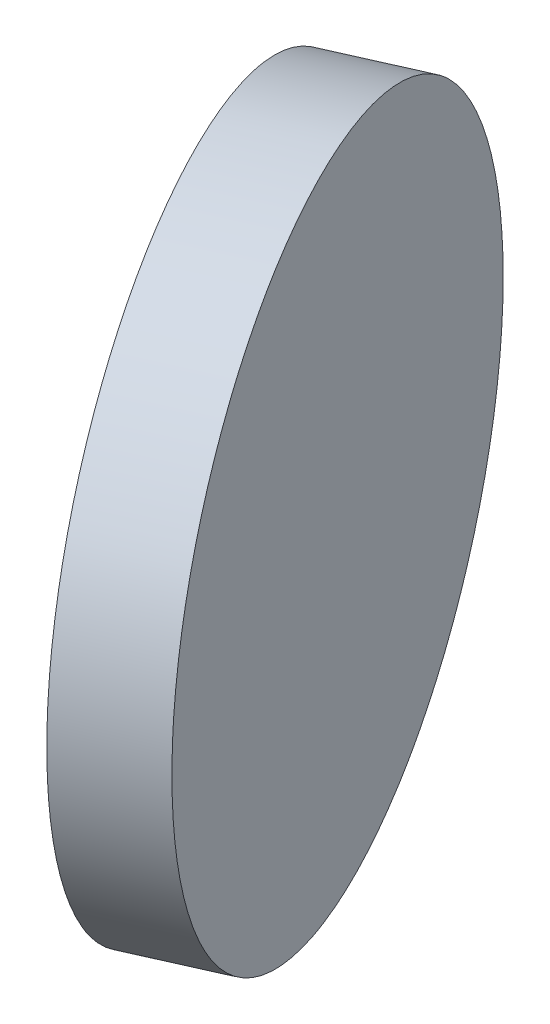
ISO-10303-21;
HEADER;
FILE_DESCRIPTION(('STEP AP214'),'2;1');
FILE_NAME('part.step','',(''),(''),'','','');
FILE_SCHEMA(('AUTOMOTIVE_DESIGN { 1 0 10303 214 1 1 1 1 }'));
ENDSEC;
DATA;
#1=APPLICATION_CONTEXT('core data for automotive mechanical design processes');
#2=APPLICATION_PROTOCOL_DEFINITION('international standard','automotive_design',2000,#1);
#3=PRODUCT_CONTEXT('',#1,'mechanical');
#4=PRODUCT('Part','Part','',(#3));
#5=PRODUCT_RELATED_PRODUCT_CATEGORY('part','',(#4));
#6=PRODUCT_DEFINITION_FORMATION('','',#4);
#7=PRODUCT_DEFINITION_CONTEXT('part definition',#1,'design');
#8=PRODUCT_DEFINITION('design','',#6,#7);
#9=PRODUCT_DEFINITION_SHAPE('','',#8);
#10=(LENGTH_UNIT() NAMED_UNIT(*) SI_UNIT(.MILLI.,.METRE.));
#11=(NAMED_UNIT(*) PLANE_ANGLE_UNIT() SI_UNIT($,.RADIAN.));
#12=(NAMED_UNIT(*) SI_UNIT($,.STERADIAN.) SOLID_ANGLE_UNIT());
#13=UNCERTAINTY_MEASURE_WITH_UNIT(LENGTH_MEASURE(1.E-05),#10,'distance_accuracy_value','');
#14=(GEOMETRIC_REPRESENTATION_CONTEXT(3) GLOBAL_UNCERTAINTY_ASSIGNED_CONTEXT((#13)) GLOBAL_UNIT_ASSIGNED_CONTEXT((#10,
#11,#12)) REPRESENTATION_CONTEXT('',''));
#15=CARTESIAN_POINT('',(0.,0.,0.));
#16=DIRECTION('',(0.,0.,1.));
#17=DIRECTION('',(1.,0.,0.));
#18=AXIS2_PLACEMENT_3D('',#15,#16,#17);
#19=CARTESIAN_POINT('',(143.670444881715,190.866099823164,114.046120887806));
#20=CARTESIAN_POINT('',(143.670444881715,191.240465528177,114.046120887806));
#21=CARTESIAN_POINT('',(143.700439109001,191.989196938203,114.113489025295));
#22=CARTESIAN_POINT('',(143.833684139788,193.069134060952,114.412762264382));
#23=CARTESIAN_POINT('',(144.050062328623,194.064409813418,114.898755633578));
#24=CARTESIAN_POINT('',(144.341258383057,194.936776306592,115.552792680253));
#25=CARTESIAN_POINT('',(144.696081802022,195.652708985369,116.349739127491));
#26=CARTESIAN_POINT('',(145.100896920515,196.184694958404,117.258968770258));
#27=CARTESIAN_POINT('',(145.540146920555,196.512290303094,118.245540423285));
#28=CARTESIAN_POINT('',(145.996951670974,196.622905714061,119.271540691221));
#29=CARTESIAN_POINT('',(146.453756421393,196.512290303094,120.297540959156));
#30=CARTESIAN_POINT('',(146.893006421433,196.184694958404,121.284112612183));
#31=CARTESIAN_POINT('',(147.297821539926,195.652708985369,122.19334225495));
#32=CARTESIAN_POINT('',(147.652644958891,194.936776306592,122.990288702188));
#33=CARTESIAN_POINT('',(147.943841013325,194.064409813418,123.644325748863));
#34=CARTESIAN_POINT('',(148.160219202161,193.069134060952,124.130319118059));
#35=CARTESIAN_POINT('',(148.293464232947,191.989196938203,124.429592357146));
#36=CARTESIAN_POINT('',(148.338455573876,190.866099823164,124.530644563379));
#37=CARTESIAN_POINT('',(148.293464232948,189.743002708125,124.429592357146));
#38=CARTESIAN_POINT('',(148.160219202161,188.663065585376,124.130319118059));
#39=CARTESIAN_POINT('',(147.943841013325,187.66778983291,123.644325748863));
#40=CARTESIAN_POINT('',(147.652644958891,186.795423339736,122.990288702188));
#41=CARTESIAN_POINT('',(147.297821539926,186.079490660959,122.19334225495));
#42=CARTESIAN_POINT('',(146.893006421433,185.547504687924,121.284112612183));
#43=CARTESIAN_POINT('',(146.453756421394,185.219909343234,120.297540959156));
#44=CARTESIAN_POINT('',(145.996951670974,185.109293932267,119.27154069122));
#45=CARTESIAN_POINT('',(145.540146920555,185.219909343234,118.245540423285));
#46=CARTESIAN_POINT('',(145.100896920515,185.547504687924,117.258968770258));
#47=CARTESIAN_POINT('',(144.696081802023,186.079490660959,116.349739127491));
#48=CARTESIAN_POINT('',(144.341258383057,186.795423339736,115.552792680253));
#49=CARTESIAN_POINT('',(144.050062328623,187.66778983291,114.898755633578));
#50=CARTESIAN_POINT('',(143.833684139788,188.663065585376,114.412762264382));
#51=CARTESIAN_POINT('',(143.700439109001,189.743002708125,114.113489025295));
#52=CARTESIAN_POINT('',(143.670444881715,190.491734118151,114.046120887806));
#53=CARTESIAN_POINT('',(143.670444881715,190.866099823164,114.046120887806));
#54=B_SPLINE_CURVE_WITH_KNOTS('',3,(#19,#20,#21,#22,#23,#24,#25,#26,#27,#28,#29,#30,#31,#32,#33,
#34,#35,#36,#37,#38,#39,#40,#41,#42,#43,#44,#45,#46,#47,#48,#49,#50,#51,#52,#53),.UNSPECIFIED.,
.T.,.F.,(4,1,1,1,1,1,1,1,1,1,1,1,1,1,1,1,1,1,1,1,1,1,1,1,1,1,1,1,1,1,1,1,4),(0.,
0.0312499999999998,0.0625000000000001,0.0937499999999999,0.125,0.15625,0.1875,0.21875,0.25,
0.28125,0.3125,0.34375,0.375,0.40625,0.4375,0.46875,0.5,0.53125,0.5625,0.59375,0.625,
0.656249999999999,0.6875,0.71875,0.75,0.78125,0.8125,0.84375,0.875,0.90625,0.9375,0.96875,1.),.UNSPECIFIED.);
#55=DIRECTION('',(0.913545457642608,0.,-0.406736643075785));
#56=VECTOR('',#55,1.);
#57=SURFACE_OF_LINEAR_EXTRUSION('',#54,#56);
#58=CARTESIAN_POINT('',(143.670444881715,190.866099823164,114.046120887806));
#59=CARTESIAN_POINT('',(143.670444883202,190.940973263994,114.046120891146));
#60=CARTESIAN_POINT('',(143.671044770926,191.015846377531,114.047468261033));
#61=CARTESIAN_POINT('',(143.673439696991,191.165477512427,114.052847353047));
#62=CARTESIAN_POINT('',(143.675234743176,191.240235533028,114.056879092789));
#63=CARTESIAN_POINT('',(143.680015372269,191.389521311145,114.067616561535));
#64=CARTESIAN_POINT('',(143.683000959202,191.46404906788,114.074322299578));
#65=CARTESIAN_POINT('',(143.690158070176,191.612759345707,114.090397434022));
#66=CARTESIAN_POINT('',(143.694329590209,191.686941867964,114.099766821419));
#67=CARTESIAN_POINT('',(143.70385397706,191.834846705146,114.121158944533));
#68=CARTESIAN_POINT('',(143.709206836125,191.908569023089,114.13318166284));
#69=CARTESIAN_POINT('',(143.721089278496,192.055438189221,114.159870065369));
#70=CARTESIAN_POINT('',(143.727618861802,192.128585037411,114.174535749592));
#71=CARTESIAN_POINT('',(143.741841066667,192.274192430149,114.206479344725));
#72=CARTESIAN_POINT('',(143.749533695857,192.34665297019,114.223757272775));
#73=CARTESIAN_POINT('',(143.766068347761,192.49077721933,114.260894708995));
#74=CARTESIAN_POINT('',(143.77491037436,192.562440925734,114.280754225891));
#75=CARTESIAN_POINT('',(143.79373018154,192.704860892097,114.323024204896));
#76=CARTESIAN_POINT('',(143.803707958283,192.775617155124,114.345434658381));
#77=CARTESIAN_POINT('',(143.82478564197,192.916111689556,114.392775911052));
#78=CARTESIAN_POINT('',(143.835885541552,192.985849967639,114.417706693699));
#79=CARTESIAN_POINT('',(143.859193790706,193.124197697504,114.470057878434));
#80=CARTESIAN_POINT('',(143.871402140278,193.192807149287,114.497478280522));
#81=CARTESIAN_POINT('',(143.896905071786,193.328795087881,114.554758802531));
#82=CARTESIAN_POINT('',(143.910199660849,193.396173566611,114.584618938461));
#83=CARTESIAN_POINT('',(143.937852918378,193.529597699914,114.64672917179));
#84=CARTESIAN_POINT('',(143.952211590441,193.595643349979,114.678979277267));
#85=CARTESIAN_POINT('',(143.981970859134,193.726299878153,114.745819689116));
#86=CARTESIAN_POINT('',(143.997371452242,193.790910761109,114.780409987576));
#87=CARTESIAN_POINT('',(144.029192429219,193.918595868576,114.851881072047));
#88=CARTESIAN_POINT('',(144.045612806395,193.981670103168,114.888761843027));
#89=CARTESIAN_POINT('',(144.079451139384,194.106179770571,114.964763983288));
#90=CARTESIAN_POINT('',(144.096869095196,194.167615203383,115.003885352569));
#91=CARTESIAN_POINT('',(144.132672689993,194.288757747756,115.08430154312));
#92=CARTESIAN_POINT('',(144.151058335326,194.348464847973,115.12559637865));
#93=CARTESIAN_POINT('',(144.188767499301,194.466061450782,115.210292547652));
#94=CARTESIAN_POINT('',(144.208091021113,194.52395094723,115.253693888243));
#95=CARTESIAN_POINT('',(144.247646119312,194.637822980118,115.342536093393));
#96=CARTESIAN_POINT('',(144.267877692629,194.693805523004,115.387976951057));
#97=CARTESIAN_POINT('',(144.309219100595,194.80377433643,115.480831273634));
#98=CARTESIAN_POINT('',(144.33032892948,194.857760620068,115.5282447256));
#99=CARTESIAN_POINT('',(144.373396958144,194.963647388317,115.624977101759));
#100=CARTESIAN_POINT('',(144.395355157923,195.015547872929,115.674296025951));
#101=CARTESIAN_POINT('',(144.440083503939,195.117189583037,115.774757535939));
#102=CARTESIAN_POINT('',(144.462853655503,195.166930794363,115.825900133699));
#103=CARTESIAN_POINT('',(144.5091695839,195.264180695183,115.929927412097));
#104=CARTESIAN_POINT('',(144.532715363355,195.31168937713,115.982812098622));
#105=CARTESIAN_POINT('',(144.580546210819,195.404400876369,116.090241940953));
#106=CARTESIAN_POINT('',(144.604831276329,195.449603701456,116.144787091145));
#107=CARTESIAN_POINT('',(144.654104388161,195.537630181012,116.255456312284));
#108=CARTESIAN_POINT('',(144.679092429869,195.580453851092,116.311580372868));
#109=CARTESIAN_POINT('',(144.729735074019,195.663648551065,116.425325613957));
#110=CARTESIAN_POINT('',(144.755389676461,195.704019580959,116.482946794462));
#111=CARTESIAN_POINT('',(144.807323888443,195.782254422886,116.599592944397));
#112=CARTESIAN_POINT('',(144.833603502083,195.820118218465,116.658617923036));
#113=CARTESIAN_POINT('',(144.886746299748,195.893284158144,116.77797860086));
#114=CARTESIAN_POINT('',(144.913609485745,195.928586293586,116.838314304475));
#115=CARTESIAN_POINT('',(144.96787796983,195.996574408254,116.960203315393));
#116=CARTESIAN_POINT('',(144.995283266084,196.029260396323,117.02175661858));
#117=CARTESIAN_POINT('',(145.050594543727,196.091961733766,117.145987782177));
#118=CARTESIAN_POINT('',(145.078500521828,196.121977100663,117.208665635205));
#119=CARTESIAN_POINT('',(145.134771613051,196.179282606697,117.335052575398));
#120=CARTESIAN_POINT('',(145.163136726172,196.206572745834,117.398761662564));
#121=CARTESIAN_POINT('',(145.220281001478,196.258394198478,117.52710980632));
#122=CARTESIAN_POINT('',(145.24906016638,196.28292549388,117.591748869011));
#123=CARTESIAN_POINT('',(145.306987585401,196.32919574639,117.721855982351));
#124=CARTESIAN_POINT('',(145.336135840769,196.350934694058,117.787324035802));
#125=CARTESIAN_POINT('',(145.394756454065,196.391586679037,117.918988088973));
#126=CARTESIAN_POINT('',(145.424228810898,196.410499725898,117.985184086233));
#127=CARTESIAN_POINT('',(145.48345267297,196.445466343994,118.11820305834));
#128=CARTESIAN_POINT('',(145.513204176377,196.46151993399,118.185026029071));
#129=CARTESIAN_POINT('',(145.572941248193,196.490734027624,118.319197689135));
#130=CARTESIAN_POINT('',(145.602926816603,196.503894531262,118.38654637847));
#131=CARTESIAN_POINT('',(145.663085132781,196.52731112526,118.521664168862));
#132=CARTESIAN_POINT('',(145.693257881776,196.537567196561,118.589433272675));
#133=CARTESIAN_POINT('',(145.753743803927,196.555163622046,118.72528687813));
#134=CARTESIAN_POINT('',(145.784056977557,196.562503966374,118.793371380838));
#135=CARTESIAN_POINT('',(145.844776962771,196.574257588677,118.929750700538));
#136=CARTESIAN_POINT('',(145.875183774037,196.578670876546,118.998045516819));
#137=CARTESIAN_POINT('',(145.936044280733,196.58455902777,119.134740452936));
#138=CARTESIAN_POINT('',(145.966497975854,196.586033910405,119.203140572078));
#139=CARTESIAN_POINT('',(146.027405366095,196.586033910405,119.339940810363));
#140=CARTESIAN_POINT('',(146.057859061215,196.58455902777,119.408340929505));
#141=CARTESIAN_POINT('',(146.118719567911,196.578670876546,119.545035865622));
#142=CARTESIAN_POINT('',(146.149126379177,196.574257588677,119.613330681903));
#143=CARTESIAN_POINT('',(146.209846364391,196.562503966374,119.749710001603));
#144=CARTESIAN_POINT('',(146.240159538021,196.555163622046,119.817794504311));
#145=CARTESIAN_POINT('',(146.300645460172,196.537567196561,119.953648109766));
#146=CARTESIAN_POINT('',(146.330818209168,196.52731112526,120.021417213579));
#147=CARTESIAN_POINT('',(146.390976525346,196.503894531262,120.156535003971));
#148=CARTESIAN_POINT('',(146.420962093755,196.490734027624,120.223883693306));
#149=CARTESIAN_POINT('',(146.480699165572,196.46151993399,120.35805535337));
#150=CARTESIAN_POINT('',(146.510450668978,196.445466343994,120.424878324101));
#151=CARTESIAN_POINT('',(146.569674531051,196.410499725898,120.557897296208));
#152=CARTESIAN_POINT('',(146.599146887883,196.391586679037,120.624093293467));
#153=CARTESIAN_POINT('',(146.657767501179,196.350934694059,120.755757346639));
#154=CARTESIAN_POINT('',(146.686915756547,196.32919574639,120.82122540009));
#155=CARTESIAN_POINT('',(146.744843175569,196.28292549388,120.95133251343));
#156=CARTESIAN_POINT('',(146.77362234047,196.258394198478,121.015971576121));
#157=CARTESIAN_POINT('',(146.830766615776,196.206572745834,121.144319719877));
#158=CARTESIAN_POINT('',(146.859131728897,196.179282606697,121.208028807043));
#159=CARTESIAN_POINT('',(146.91540282012,196.121977100663,121.334415747236));
#160=CARTESIAN_POINT('',(146.943308798221,196.091961733767,121.397093600264));
#161=CARTESIAN_POINT('',(146.998620075864,196.029260396323,121.521324763861));
#162=CARTESIAN_POINT('',(147.026025372118,195.996574408254,121.582878067048));
#163=CARTESIAN_POINT('',(147.080293856203,195.928586293586,121.704767077966));
#164=CARTESIAN_POINT('',(147.1071570422,195.893284158145,121.765102781581));
#165=CARTESIAN_POINT('',(147.160299839865,195.820118218465,121.884463459405));
#166=CARTESIAN_POINT('',(147.186579453505,195.782254422886,121.943488438044));
#167=CARTESIAN_POINT('',(147.238513665487,195.704019580959,122.060134587979));
#168=CARTESIAN_POINT('',(147.264168267929,195.663648551065,122.117755768484));
#169=CARTESIAN_POINT('',(147.31481091208,195.580453851092,122.231501009573));
#170=CARTESIAN_POINT('',(147.339798953788,195.537630181012,122.287625070157));
#171=CARTESIAN_POINT('',(147.389072065619,195.449603701456,122.398294291296));
#172=CARTESIAN_POINT('',(147.413357131129,195.404400876369,122.452839441488));
#173=CARTESIAN_POINT('',(147.461187978593,195.31168937713,122.560269283819));
#174=CARTESIAN_POINT('',(147.484733758048,195.264180695183,122.613153970344));
#175=CARTESIAN_POINT('',(147.531049686445,195.166930794363,122.717181248742));
#176=CARTESIAN_POINT('',(147.553819838009,195.117189583038,122.768323846502));
#177=CARTESIAN_POINT('',(147.598548184025,195.015547872929,122.86878535649));
#178=CARTESIAN_POINT('',(147.620506383804,194.963647388317,122.918104280682));
#179=CARTESIAN_POINT('',(147.663574412468,194.857760620068,123.014836656841));
#180=CARTESIAN_POINT('',(147.684684241353,194.80377433643,123.062250108807));
#181=CARTESIAN_POINT('',(147.726025649319,194.693805523004,123.155104431384));
#182=CARTESIAN_POINT('',(147.746257222636,194.637822980118,123.200545289048));
#183=CARTESIAN_POINT('',(147.785812320835,194.52395094723,123.289387494198));
#184=CARTESIAN_POINT('',(147.805135842647,194.466061450782,123.332788834789));
#185=CARTESIAN_POINT('',(147.842845006622,194.348464847973,123.417485003791));
#186=CARTESIAN_POINT('',(147.861230651955,194.288757747756,123.458779839321));
#187=CARTESIAN_POINT('',(147.897034246752,194.167615203384,123.539196029872));
#188=CARTESIAN_POINT('',(147.914452202564,194.106179770571,123.578317399153));
#189=CARTESIAN_POINT('',(147.948290535553,193.981670103168,123.654319539414));
#190=CARTESIAN_POINT('',(147.96471091273,193.918595868577,123.691200310394));
#191=CARTESIAN_POINT('',(147.996531889706,193.790910761109,123.762671394865));
#192=CARTESIAN_POINT('',(148.011932482814,193.726299878153,123.797261693325));
#193=CARTESIAN_POINT('',(148.041691751507,193.595643349979,123.864102105174));
#194=CARTESIAN_POINT('',(148.05605042357,193.529597699914,123.896352210651));
#195=CARTESIAN_POINT('',(148.083703681099,193.396173566612,123.95846244398));
#196=CARTESIAN_POINT('',(148.096998270162,193.328795087881,123.98832257991));
#197=CARTESIAN_POINT('',(148.12250120167,193.192807149288,124.045603101919));
#198=CARTESIAN_POINT('',(148.134709551242,193.124197697504,124.073023504007));
#199=CARTESIAN_POINT('',(148.158017800396,192.985849967639,124.125374688742));
#200=CARTESIAN_POINT('',(148.169117699978,192.916111689557,124.150305471389));
#201=CARTESIAN_POINT('',(148.190195383666,192.775617155122,124.19764672406));
#202=CARTESIAN_POINT('',(148.200173160408,192.704860892092,124.220057177545));
#203=CARTESIAN_POINT('',(148.218992967588,192.562440925739,124.26232715655));
#204=CARTESIAN_POINT('',(148.227834994187,192.490777219348,124.282186673446));
#205=CARTESIAN_POINT('',(148.244369646091,192.346652970171,124.319324109667));
#206=CARTESIAN_POINT('',(148.252062275282,192.274192430079,124.336602037717));
#207=CARTESIAN_POINT('',(148.266284480146,192.128585037481,124.368545632848));
#208=CARTESIAN_POINT('',(148.27281406345,192.055438189482,124.383211317067));
#209=CARTESIAN_POINT('',(148.284696505825,191.908569022828,124.409899719606));
#210=CARTESIAN_POINT('',(148.290049364896,191.834846704172,124.421922437925));
#211=CARTESIAN_POINT('',(148.299573751731,191.686941868938,124.443314561005));
#212=CARTESIAN_POINT('',(148.303745271743,191.612759349342,124.452683948355));
#213=CARTESIAN_POINT('',(148.310902382775,191.464049064245,124.468759082928));
#214=CARTESIAN_POINT('',(148.313887969786,191.389521297577,124.475464821146));
#215=CARTESIAN_POINT('',(148.318668598666,191.240235546595,124.486202289412));
#216=CARTESIAN_POINT('',(148.320463644559,191.16547756306,124.490234028499));
#217=CARTESIAN_POINT('',(148.322858571421,191.015846326898,124.495613122303));
#218=CARTESIAN_POINT('',(148.323458460233,190.940973075031,124.496960494635));
#219=CARTESIAN_POINT('',(148.323458460233,190.791226571297,124.496960494635));
#220=CARTESIAN_POINT('',(148.322858571421,190.71635331943,124.495613122303));
#221=CARTESIAN_POINT('',(148.320463644559,190.566722083268,124.490234028499));
#222=CARTESIAN_POINT('',(148.318668598666,190.491964099733,124.486202289412));
#223=CARTESIAN_POINT('',(148.313887969786,190.342678348751,124.475464821146));
#224=CARTESIAN_POINT('',(148.310902382775,190.268150582083,124.468759082928));
#225=CARTESIAN_POINT('',(148.303745271743,190.119440296986,124.452683948355));
#226=CARTESIAN_POINT('',(148.299573751731,190.04525777739,124.443314561005));
#227=CARTESIAN_POINT('',(148.290049364897,189.897352942156,124.421922437925));
#228=CARTESIAN_POINT('',(148.284696505826,189.8236306235,124.409899719606));
#229=CARTESIAN_POINT('',(148.27281406345,189.676761456846,124.383211317067));
#230=CARTESIAN_POINT('',(148.266284480146,189.603614608847,124.368545632848));
#231=CARTESIAN_POINT('',(148.252062275282,189.458007216249,124.336602037718));
#232=CARTESIAN_POINT('',(148.244369646091,189.385546676157,124.319324109667));
#233=CARTESIAN_POINT('',(148.227834994187,189.24142242698,124.282186673446));
#234=CARTESIAN_POINT('',(148.218992967588,189.169758720589,124.26232715655));
#235=CARTESIAN_POINT('',(148.200173160408,189.027338754236,124.220057177545));
#236=CARTESIAN_POINT('',(148.190195383666,188.956582491206,124.19764672406));
#237=CARTESIAN_POINT('',(148.169117699978,188.816087956771,124.150305471389));
#238=CARTESIAN_POINT('',(148.158017800396,188.746349678689,124.125374688742));
#239=CARTESIAN_POINT('',(148.134709551242,188.608001948824,124.073023504007));
#240=CARTESIAN_POINT('',(148.12250120167,188.539392497041,124.045603101919));
#241=CARTESIAN_POINT('',(148.096998270162,188.403404558447,123.98832257991));
#242=CARTESIAN_POINT('',(148.083703681099,188.336026079717,123.95846244398));
#243=CARTESIAN_POINT('',(148.05605042357,188.202601946414,123.896352210651));
#244=CARTESIAN_POINT('',(148.041691751507,188.136556296349,123.864102105174));
#245=CARTESIAN_POINT('',(148.011932482815,188.005899768175,123.797261693325));
#246=CARTESIAN_POINT('',(147.996531889707,187.941288885219,123.762671394865));
#247=CARTESIAN_POINT('',(147.96471091273,187.813603777752,123.691200310394));
#248=CARTESIAN_POINT('',(147.948290535553,187.75052954316,123.654319539414));
#249=CARTESIAN_POINT('',(147.914452202564,187.626019875757,123.578317399153));
#250=CARTESIAN_POINT('',(147.897034246752,187.564584442945,123.539196029872));
#251=CARTESIAN_POINT('',(147.861230651955,187.443441898572,123.458779839321));
#252=CARTESIAN_POINT('',(147.842845006622,187.383734798355,123.417485003791));
#253=CARTESIAN_POINT('',(147.805135842647,187.266138195546,123.332788834789));
#254=CARTESIAN_POINT('',(147.785812320835,187.208248699098,123.289387494198));
#255=CARTESIAN_POINT('',(147.746257222636,187.09437666621,123.200545289048));
#256=CARTESIAN_POINT('',(147.726025649319,187.038394123324,123.155104431384));
#257=CARTESIAN_POINT('',(147.684684241353,186.928425309898,123.062250108807));
#258=CARTESIAN_POINT('',(147.663574412468,186.87443902626,123.014836656841));
#259=CARTESIAN_POINT('',(147.620506383804,186.768552258011,122.918104280682));
#260=CARTESIAN_POINT('',(147.598548184025,186.716651773399,122.86878535649));
#261=CARTESIAN_POINT('',(147.553819838009,186.61501006329,122.768323846502));
#262=CARTESIAN_POINT('',(147.531049686445,186.565268851965,122.717181248742));
#263=CARTESIAN_POINT('',(147.484733758048,186.468018951145,122.613153970344));
#264=CARTESIAN_POINT('',(147.461187978593,186.420510269198,122.560269283819));
#265=CARTESIAN_POINT('',(147.41335713113,186.327798769959,122.452839441488));
#266=CARTESIAN_POINT('',(147.38907206562,186.282595944872,122.398294291296));
#267=CARTESIAN_POINT('',(147.339798953788,186.194569465316,122.287625070157));
#268=CARTESIAN_POINT('',(147.31481091208,186.151745795236,122.231501009573));
#269=CARTESIAN_POINT('',(147.26416826793,186.068551095263,122.117755768484));
#270=CARTESIAN_POINT('',(147.238513665488,186.028180065369,122.060134587979));
#271=CARTESIAN_POINT('',(147.186579453506,185.949945223442,121.943488438044));
#272=CARTESIAN_POINT('',(147.160299839866,185.912081427863,121.884463459405));
#273=CARTESIAN_POINT('',(147.1071570422,185.838915488184,121.765102781581));
#274=CARTESIAN_POINT('',(147.080293856203,185.803613352742,121.704767077966));
#275=CARTESIAN_POINT('',(147.026025372118,185.735625238074,121.582878067048));
#276=CARTESIAN_POINT('',(146.998620075864,185.702939250005,121.521324763861));
#277=CARTESIAN_POINT('',(146.943308798222,185.640237912562,121.397093600264));
#278=CARTESIAN_POINT('',(146.91540282012,185.610222545665,121.334415747236));
#279=CARTESIAN_POINT('',(146.859131728897,185.552917039631,121.208028807043));
#280=CARTESIAN_POINT('',(146.830766615777,185.525626900494,121.144319719877));
#281=CARTESIAN_POINT('',(146.77362234047,185.47380544785,121.015971576121));
#282=CARTESIAN_POINT('',(146.744843175569,185.449274152448,120.95133251343));
#283=CARTESIAN_POINT('',(146.686915756547,185.403003899938,120.82122540009));
#284=CARTESIAN_POINT('',(146.65776750118,185.381264952269,120.755757346639));
#285=CARTESIAN_POINT('',(146.599146887883,185.340612967291,120.624093293468));
#286=CARTESIAN_POINT('',(146.569674531051,185.32169992043,120.557897296208));
#287=CARTESIAN_POINT('',(146.510450668978,185.286733302335,120.424878324101));
#288=CARTESIAN_POINT('',(146.480699165572,185.270679712338,120.35805535337));
#289=CARTESIAN_POINT('',(146.420962093755,185.241465618704,120.223883693306));
#290=CARTESIAN_POINT('',(146.390976525346,185.228305115066,120.156535003971));
#291=CARTESIAN_POINT('',(146.330818209168,185.204888521068,120.021417213579));
#292=CARTESIAN_POINT('',(146.300645460173,185.194632449767,119.953648109766));
#293=CARTESIAN_POINT('',(146.240159538021,185.177036024282,119.817794504311));
#294=CARTESIAN_POINT('',(146.209846364391,185.169695679954,119.749710001604));
#295=CARTESIAN_POINT('',(146.149126379177,185.157942057651,119.613330681903));
#296=CARTESIAN_POINT('',(146.118719567911,185.153528769782,119.545035865622));
#297=CARTESIAN_POINT('',(146.057859061215,185.147640618558,119.408340929505));
#298=CARTESIAN_POINT('',(146.027405366095,185.146165735923,119.339940810363));
#299=CARTESIAN_POINT('',(145.966497975854,185.146165735923,119.203140572078));
#300=CARTESIAN_POINT('',(145.936044280733,185.147640618558,119.134740452936));
#301=CARTESIAN_POINT('',(145.875183774037,185.153528769782,118.998045516819));
#302=CARTESIAN_POINT('',(145.844776962771,185.157942057651,118.929750700538));
#303=CARTESIAN_POINT('',(145.784056977558,185.169695679954,118.793371380838));
#304=CARTESIAN_POINT('',(145.753743803927,185.177036024282,118.72528687813));
#305=CARTESIAN_POINT('',(145.693257881776,185.194632449767,118.589433272675));
#306=CARTESIAN_POINT('',(145.663085132781,185.204888521068,118.521664168862));
#307=CARTESIAN_POINT('',(145.602926816603,185.228305115066,118.38654637847));
#308=CARTESIAN_POINT('',(145.572941248193,185.241465618704,118.319197689135));
#309=CARTESIAN_POINT('',(145.513204176377,185.270679712338,118.185026029071));
#310=CARTESIAN_POINT('',(145.48345267297,185.286733302334,118.11820305834));
#311=CARTESIAN_POINT('',(145.424228810898,185.32169992043,117.985184086233));
#312=CARTESIAN_POINT('',(145.394756454065,185.340612967291,117.918988088974));
#313=CARTESIAN_POINT('',(145.336135840769,185.381264952269,117.787324035802));
#314=CARTESIAN_POINT('',(145.306987585402,185.403003899938,117.721855982351));
#315=CARTESIAN_POINT('',(145.24906016638,185.449274152448,117.591748869011));
#316=CARTESIAN_POINT('',(145.220281001479,185.47380544785,117.52710980632));
#317=CARTESIAN_POINT('',(145.163136726172,185.525626900494,117.398761662564));
#318=CARTESIAN_POINT('',(145.134771613051,185.552917039631,117.335052575398));
#319=CARTESIAN_POINT('',(145.078500521829,185.610222545665,117.208665635205));
#320=CARTESIAN_POINT('',(145.050594543727,185.640237912562,117.145987782177));
#321=CARTESIAN_POINT('',(144.995283266084,185.702939250005,117.02175661858));
#322=CARTESIAN_POINT('',(144.96787796983,185.735625238074,116.960203315393));
#323=CARTESIAN_POINT('',(144.913609485746,185.803613352742,116.838314304475));
#324=CARTESIAN_POINT('',(144.886746299748,185.838915488183,116.77797860086));
#325=CARTESIAN_POINT('',(144.833603502083,185.912081427863,116.658617923036));
#326=CARTESIAN_POINT('',(144.807323888443,185.949945223442,116.599592944397));
#327=CARTESIAN_POINT('',(144.755389676461,186.028180065369,116.482946794462));
#328=CARTESIAN_POINT('',(144.729735074019,186.068551095263,116.425325613957));
#329=CARTESIAN_POINT('',(144.679092429869,186.151745795236,116.311580372868));
#330=CARTESIAN_POINT('',(144.654104388161,186.194569465316,116.255456312284));
#331=CARTESIAN_POINT('',(144.604831276329,186.282595944872,116.144787091145));
#332=CARTESIAN_POINT('',(144.580546210819,186.327798769959,116.090241940953));
#333=CARTESIAN_POINT('',(144.532715363355,186.420510269198,115.982812098622));
#334=CARTESIAN_POINT('',(144.509169583901,186.468018951145,115.929927412097));
#335=CARTESIAN_POINT('',(144.462853655503,186.565268851965,115.825900133699));
#336=CARTESIAN_POINT('',(144.440083503939,186.61501006329,115.774757535939));
#337=CARTESIAN_POINT('',(144.395355157923,186.716651773399,115.674296025951));
#338=CARTESIAN_POINT('',(144.373396958145,186.768552258011,115.624977101759));
#339=CARTESIAN_POINT('',(144.330328929481,186.87443902626,115.5282447256));
#340=CARTESIAN_POINT('',(144.309219100596,186.928425309898,115.480831273634));
#341=CARTESIAN_POINT('',(144.267877692629,187.038394123324,115.387976951057));
#342=CARTESIAN_POINT('',(144.247646119312,187.09437666621,115.342536093393));
#343=CARTESIAN_POINT('',(144.208091021113,187.208248699098,115.253693888243));
#344=CARTESIAN_POINT('',(144.188767499301,187.266138195546,115.210292547652));
#345=CARTESIAN_POINT('',(144.151058335326,187.383734798355,115.12559637865));
#346=CARTESIAN_POINT('',(144.132672689993,187.443441898572,115.08430154312));
#347=CARTESIAN_POINT('',(144.096869095196,187.564584442944,115.003885352569));
#348=CARTESIAN_POINT('',(144.079451139384,187.626019875757,114.964763983288));
#349=CARTESIAN_POINT('',(144.045612806395,187.75052954316,114.888761843027));
#350=CARTESIAN_POINT('',(144.029192429219,187.813603777751,114.851881072047));
#351=CARTESIAN_POINT('',(143.997371452242,187.941288885219,114.780409987576));
#352=CARTESIAN_POINT('',(143.981970859134,188.005899768175,114.745819689116));
#353=CARTESIAN_POINT('',(143.952211590441,188.136556296348,114.678979277267));
#354=CARTESIAN_POINT('',(143.937852918378,188.202601946414,114.64672917179));
#355=CARTESIAN_POINT('',(143.910199660849,188.336026079716,114.584618938461));
#356=CARTESIAN_POINT('',(143.896905071786,188.403404558447,114.554758802531));
#357=CARTESIAN_POINT('',(143.871402140278,188.53939249704,114.497478280522));
#358=CARTESIAN_POINT('',(143.859193790706,188.608001948823,114.470057878434));
#359=CARTESIAN_POINT('',(143.835885541552,188.746349678689,114.417706693699));
#360=CARTESIAN_POINT('',(143.82478564197,188.816087956772,114.392775911052));
#361=CARTESIAN_POINT('',(143.803707958283,188.956582491204,114.345434658381));
#362=CARTESIAN_POINT('',(143.793730181541,189.027338754231,114.323024204896));
#363=CARTESIAN_POINT('',(143.77491037436,189.169758720594,114.280754225891));
#364=CARTESIAN_POINT('',(143.766068347761,189.241422426998,114.260894708995));
#365=CARTESIAN_POINT('',(143.749533695857,189.385546676138,114.223757272775));
#366=CARTESIAN_POINT('',(143.741841066667,189.458007216179,114.206479344725));
#367=CARTESIAN_POINT('',(143.727618861802,189.603614608917,114.174535749592));
#368=CARTESIAN_POINT('',(143.721089278496,189.676761457107,114.159870065369));
#369=CARTESIAN_POINT('',(143.709206836125,189.823630623239,114.13318166284));
#370=CARTESIAN_POINT('',(143.70385397706,189.897352941182,114.121158944533));
#371=CARTESIAN_POINT('',(143.694329590209,190.045257778364,114.099766821419));
#372=CARTESIAN_POINT('',(143.690158070177,190.119440300621,114.090397434022));
#373=CARTESIAN_POINT('',(143.683000959202,190.268150578448,114.074322299578));
#374=CARTESIAN_POINT('',(143.680015372269,190.342678335183,114.067616561535));
#375=CARTESIAN_POINT('',(143.675234743176,190.4919641133,114.056879092789));
#376=CARTESIAN_POINT('',(143.673439696991,190.566722133901,114.052847353047));
#377=CARTESIAN_POINT('',(143.671044770926,190.716353268797,114.047468261033));
#378=CARTESIAN_POINT('',(143.670444883202,190.791226382334,114.046120891146));
#379=CARTESIAN_POINT('',(143.670444881715,190.866099823164,114.046120887806));
#380=B_SPLINE_CURVE_WITH_KNOTS('',3,(#58,#59,#60,#61,#62,#63,#64,#65,#66,#67,#68,#69,#70,#71,
#72,#73,#74,#75,#76,#77,#78,#79,#80,#81,#82,#83,#84,#85,#86,#87,#88,#89,#90,#91,#92,#93,#94,#95,
#96,#97,#98,#99,#100,#101,#102,#103,#104,#105,#106,#107,#108,#109,#110,#111,#112,#113,#114,#115,
#116,#117,#118,#119,#120,#121,#122,#123,#124,#125,#126,#127,#128,#129,#130,#131,#132,#133,#134,
#135,#136,#137,#138,#139,#140,#141,#142,#143,#144,#145,#146,#147,#148,#149,#150,#151,#152,#153,
#154,#155,#156,#157,#158,#159,#160,#161,#162,#163,#164,#165,#166,#167,#168,#169,#170,#171,#172,
#173,#174,#175,#176,#177,#178,#179,#180,#181,#182,#183,#184,#185,#186,#187,#188,#189,#190,#191,
#192,#193,#194,#195,#196,#197,#198,#199,#200,#201,#202,#203,#204,#205,#206,#207,#208,#209,#210,
#211,#212,#213,#214,#215,#216,#217,#218,#219,#220,#221,#222,#223,#224,#225,#226,#227,#228,#229,
#230,#231,#232,#233,#234,#235,#236,#237,#238,#239,#240,#241,#242,#243,#244,#245,#246,#247,#248,
#249,#250,#251,#252,#253,#254,#255,#256,#257,#258,#259,#260,#261,#262,#263,#264,#265,#266,#267,
#268,#269,#270,#271,#272,#273,#274,#275,#276,#277,#278,#279,#280,#281,#282,#283,#284,#285,#286,
#287,#288,#289,#290,#291,#292,#293,#294,#295,#296,#297,#298,#299,#300,#301,#302,#303,#304,#305,
#306,#307,#308,#309,#310,#311,#312,#313,#314,#315,#316,#317,#318,#319,#320,#321,#322,#323,#324,
#325,#326,#327,#328,#329,#330,#331,#332,#333,#334,#335,#336,#337,#338,#339,#340,#341,#342,#343,
#344,#345,#346,#347,#348,#349,#350,#351,#352,#353,#354,#355,#356,#357,#358,#359,#360,#361,#362,
#363,#364,#365,#366,#367,#368,#369,#370,#371,#372,#373,#374,#375,#376,#377,#378,#379),
.UNSPECIFIED.,.F.,.F.,(4,2,2,2,2,2,2,2,2,2,2,2,2,2,2,2,2,2,2,2,2,2,2,2,2,2,2,2,2,2,2,2,2,2,2,2,
2,2,2,2,2,2,2,2,2,2,2,2,2,2,2,2,2,2,2,2,2,2,2,2,2,2,2,2,2,2,2,2,2,2,2,2,2,2,2,2,2,2,2,2,2,2,2,2,
2,2,2,2,2,2,2,2,2,2,2,2,2,2,2,2,2,2,2,2,2,2,2,2,2,2,2,2,2,2,2,2,2,2,2,2,2,2,2,2,2,2,2,2,2,2,2,2,
2,2,2,2,2,2,2,2,2,2,2,2,2,2,2,2,2,2,2,2,2,2,2,2,2,2,2,2,4),(0.,0.224605350375116,
0.449212174577053,0.67381975801935,0.898426582221217,1.1230319325963,1.34763728297138,
1.57224410717334,1.7968516906156,2.02145851481755,2.24606386519264,2.47066921556777,
2.69527603976969,2.91988362321193,3.1444904474139,3.36909579778899,3.59370114816409,
3.81830797236603,4.04291555580833,4.26752238001017,4.49212773038529,4.71673308076039,
4.94133990496231,5.1659474884046,5.39055431260655,5.61515966298163,5.83976501335673,
6.06437183755867,6.28897942100094,6.51358624520286,6.73819159557797,6.96279694595305,
7.18740377015496,7.41201135359728,7.63661817779918,7.86122352817429,8.08582887854943,
8.31043570275136,8.53504328619363,8.75965011039556,8.98425546077069,9.20886081114578,
9.43346763534769,9.65807521878999,9.88268204299192,10.107287393367,10.3318927437421,
10.556499567944,10.7811071513863,11.0057139755882,11.2303193259633,11.4549246763385,
11.6795315005404,11.9041390839826,12.1287459081846,12.3533512585597,12.5779566089348,
12.8025634331367,13.027171016579,13.2517778407809,13.476383191156,13.7009885415311,
13.925595365733,14.1502029491753,14.3748097733772,14.5994151237524,14.8240204741274,
15.0486272983294,15.2732348817717,15.4978417059736,15.7224470563487,15.9470524067238,
16.1716592309257,16.396266814368,16.6208736385699,16.845478988945,17.0700843393201,
17.2946911635221,17.5192987469644,17.7439055711663,17.9685109215414,18.1931162719165,
18.4177230961184,18.6423306795607,18.8669375037625,19.0915428541377,19.3161482045128,
19.5407550287147,19.765362612157,19.9899694363589,20.214574786734,20.4391801371092,
20.6637869613111,20.8883945447534,21.1130013689552,21.3376067193304,21.5622120697055,
21.7868188939074,22.0114264773497,22.2360333015516,22.4606386519267,22.6852440023018,
22.9098508265037,23.134458409946,23.3590652341479,23.583670584523,23.8082759348981,
24.0328827591,24.2574903425423,24.4820971667442,24.7067025171193,24.9313078674945,
25.1559146916964,25.3805222751386,25.6051290993406,25.8297344497157,26.0543398000908,
26.2789466242928,26.503554207735,26.728161031937,26.9527663823121,27.1773717326872,
27.4019785568891,27.6265861403314,27.8511929645333,28.0757983149084,28.3004036652835,
28.5250104894854,28.7496180729277,28.9742248971296,29.1988302475047,29.4234355978799,
29.6480424220818,29.8726500055241,30.097256829726,30.3218621801011,30.5464675304762,
30.7710743546781,30.9956819381204,31.2202887623223,31.4448941126974,31.6694994630725,
31.8941062872745,32.1187138707167,32.3433206949186,32.5679260452938,32.7925313956688,
33.0171382198708,33.2417458033131,33.4663526275149,33.69095797789,33.9155633282652,
34.1401701524671,34.3647777359093,34.5893845601113,34.8139899104864,35.0385952608615,
35.2632020850635,35.4878096685057,35.7124164927077,35.9370218430828),.UNSPECIFIED.);
#381=CARTESIAN_POINT('',(143.670444881715,190.866099823164,114.046120887806));
#382=VERTEX_POINT('',#381);
#383=EDGE_CURVE('E9',#382,#382,#380,.T.);
#384=ORIENTED_EDGE('',*,*,#383,.T.);
#385=EDGE_LOOP('',(#384));
#386=FACE_BOUND('',#385,.T.);
#387=CARTESIAN_POINT('',(145.185392190606,190.866099823164,113.371622889157));
#388=CARTESIAN_POINT('',(145.185392215046,190.775343982674,113.37162294405));
#389=CARTESIAN_POINT('',(145.186273582598,190.684588746731,113.373602527983));
#390=CARTESIAN_POINT('',(145.189790839397,190.503283241522,113.381502416096));
#391=CARTESIAN_POINT('',(145.192426742048,190.412732973827,113.387422750383));
#392=CARTESIAN_POINT('',(145.199444906478,190.232042498649,113.403185805778));
#393=CARTESIAN_POINT('',(145.203827169358,190.141902291425,113.41302852936));
#394=CARTESIAN_POINT('',(145.214329620114,189.962236374775,113.436617419974));
#395=CARTESIAN_POINT('',(145.220449795226,189.872710660842,113.450363558337));
#396=CARTESIAN_POINT('',(145.234420880055,189.694479418526,113.481743128635));
#397=CARTESIAN_POINT('',(145.242271786793,189.605773888732,113.499376553877));
#398=CARTESIAN_POINT('',(145.259681447536,189.429381259657,113.538479292128));
#399=CARTESIAN_POINT('',(145.269240214649,189.3416941682,113.559948634577));
#400=CARTESIAN_POINT('',(145.290041006169,189.16753509519,113.606667977257));
#401=CARTESIAN_POINT('',(145.301283033734,189.081063115918,113.631917984581));
#402=CARTESIAN_POINT('',(145.325425798016,188.909530768034,113.686143520982));
#403=CARTESIAN_POINT('',(145.338326523415,188.824470389796,113.715119024639));
#404=CARTESIAN_POINT('',(145.365763830686,188.655959886054,113.776744225746));
#405=CARTESIAN_POINT('',(145.380300407094,188.572509755174,113.809393910925));
#406=CARTESIAN_POINT('',(145.410973058628,188.407405181131,113.878285814223));
#407=CARTESIAN_POINT('',(145.427109145615,188.32575075129,113.914528058983));
#408=CARTESIAN_POINT('',(145.460940660013,188.16441826212,113.990514884438));
#409=CARTESIAN_POINT('',(145.478636092222,188.084740208872,114.030259475909));
#410=CARTESIAN_POINT('',(145.515546698352,187.927541493328,114.113162054625));
#411=CARTESIAN_POINT('',(145.534761862995,187.850020817863,114.156320021029));
#412=CARTESIAN_POINT('',(145.574673904261,187.697320824306,114.245963933434));
#413=CARTESIAN_POINT('',(145.595370773814,187.622141495045,114.292449863555));
#414=CARTESIAN_POINT('',(145.638197731803,187.47429179822,114.388640786113));
#415=CARTESIAN_POINT('',(145.660327830043,187.401621447825,114.438345800571));
#416=CARTESIAN_POINT('',(145.70596712964,187.258947061285,114.540853345799));
#417=CARTESIAN_POINT('',(145.72947633679,187.188943036346,114.593655889584));
#418=CARTESIAN_POINT('',(145.777820767963,187.051760071178,114.702239259812));
#419=CARTESIAN_POINT('',(145.802655985061,186.9845811162,114.758020070702));
#420=CARTESIAN_POINT('',(145.853600458348,186.853210154384,114.872443231132));
#421=CARTESIAN_POINT('',(145.879709706952,186.789018129768,114.931085563636));
#422=CARTESIAN_POINT('',(145.933143090959,186.66376638726,115.051098909069));
#423=CARTESIAN_POINT('',(145.960467233592,186.602706688016,115.112469938239));
#424=CARTESIAN_POINT('',(146.016264572332,186.483847391722,115.237792812934));
#425=CARTESIAN_POINT('',(146.044737774437,186.426047811697,115.301744671934));
#426=CARTESIAN_POINT('',(146.102768675471,186.31383933387,115.432084209679));
#427=CARTESIAN_POINT('',(146.132326369842,186.259430421821,115.498471878188));
#428=CARTESIAN_POINT('',(146.192462259208,186.154136348326,115.633539297136));
#429=CARTESIAN_POINT('',(146.223040447221,186.103251162775,115.702219031891));
#430=CARTESIAN_POINT('',(146.285149129998,186.00512368411,115.841717417387));
#431=CARTESIAN_POINT('',(146.316679629305,185.957881408377,115.912536078331));
#432=CARTESIAN_POINT('',(146.380618107162,185.867133238133,116.056144250864));
#433=CARTESIAN_POINT('',(146.413026091067,185.823627366434,116.128933774483));
#434=CARTESIAN_POINT('',(146.47864592613,185.740449430603,116.276318337134));
#435=CARTESIAN_POINT('',(146.511857774815,185.700777354674,116.35091337061));
#436=CARTESIAN_POINT('',(146.57901185502,185.625365778028,116.501743904267));
#437=CARTESIAN_POINT('',(146.612954081121,185.589626248148,116.577979392278));
#438=CARTESIAN_POINT('',(146.681493477729,185.522169067349,116.73192139752));
#439=CARTESIAN_POINT('',(146.716090650422,185.490451429863,116.809627919662));
#440=CARTESIAN_POINT('',(146.785859141807,185.431094190485,116.966330516973));
#441=CARTESIAN_POINT('',(146.821030464415,185.40345461642,117.045326600936));
#442=CARTESIAN_POINT('',(146.891867341027,185.352313929059,117.204428830756));
#443=CARTESIAN_POINT('',(146.927532894104,185.328812807999,117.284534974529));
#444=CARTESIAN_POINT('',(146.999278240309,185.286009531955,117.445677660462));
#445=CARTESIAN_POINT('',(147.035358030256,185.266707344743,117.526714195476));
#446=CARTESIAN_POINT('',(147.107851205983,185.232358129311,117.689536534017));
#447=CARTESIAN_POINT('',(147.144264592338,185.217311108416,117.771322338832));
#448=CARTESIAN_POINT('',(147.217341309613,185.191489850668,117.935455333149));
#449=CARTESIAN_POINT('',(147.254004642367,185.180715645197,118.017802526769));
#450=CARTESIAN_POINT('',(147.327498059291,185.16346084153,118.18287144382));
#451=CARTESIAN_POINT('',(147.364328143356,185.156980240626,118.265593167015));
#452=CARTESIAN_POINT('',(147.438071811995,185.148332704299,118.431224158623));
#453=CARTESIAN_POINT('',(147.47498539593,185.146165735923,118.514133425597));
#454=CARTESIAN_POINT('',(147.5488125638,185.146165735923,118.679951959546));
#455=CARTESIAN_POINT('',(147.585726147735,185.148332704299,118.76286122652));
#456=CARTESIAN_POINT('',(147.659469816375,185.156980240626,118.928492218127));
#457=CARTESIAN_POINT('',(147.696299900439,185.16346084153,119.011213941322));
#458=CARTESIAN_POINT('',(147.769793317363,185.180715645197,119.176282858374));
#459=CARTESIAN_POINT('',(147.806456650118,185.191489850668,119.258630051994));
#460=CARTESIAN_POINT('',(147.879533367393,185.217311108416,119.42276304631));
#461=CARTESIAN_POINT('',(147.915946753748,185.232358129311,119.504548851126));
#462=CARTESIAN_POINT('',(147.988439929475,185.266707344743,119.667371189666));
#463=CARTESIAN_POINT('',(148.024519719422,185.286009531955,119.748407724681));
#464=CARTESIAN_POINT('',(148.096265065627,185.328812807999,119.909550410614));
#465=CARTESIAN_POINT('',(148.131930618704,185.352313929059,119.989656554387));
#466=CARTESIAN_POINT('',(148.202767495316,185.40345461642,120.148758784206));
#467=CARTESIAN_POINT('',(148.237938817924,185.431094190485,120.22775486817));
#468=CARTESIAN_POINT('',(148.307707309309,185.490451429863,120.384457465481));
#469=CARTESIAN_POINT('',(148.342304482002,185.522169067349,120.462163987623));
#470=CARTESIAN_POINT('',(148.410843878609,185.589626248148,120.616105992864));
#471=CARTESIAN_POINT('',(148.444786104711,185.625365778028,120.692341480876));
#472=CARTESIAN_POINT('',(148.511940184915,185.700777354674,120.843172014533));
#473=CARTESIAN_POINT('',(148.5451520336,185.740449430603,120.917767048009));
#474=CARTESIAN_POINT('',(148.610771868664,185.823627366434,121.06515161066));
#475=CARTESIAN_POINT('',(148.643179852569,185.867133238133,121.137941134278));
#476=CARTESIAN_POINT('',(148.707118330425,185.957881408378,121.281549306811));
#477=CARTESIAN_POINT('',(148.738648829733,186.00512368411,121.352367967756));
#478=CARTESIAN_POINT('',(148.80075751251,186.103251162775,121.491866353251));
#479=CARTESIAN_POINT('',(148.831335700522,186.154136348326,121.560546088006));
#480=CARTESIAN_POINT('',(148.891471589889,186.259430421821,121.695613506955));
#481=CARTESIAN_POINT('',(148.92102928426,186.31383933387,121.762001175464));
#482=CARTESIAN_POINT('',(148.979060185293,186.426047811697,121.892340713209));
#483=CARTESIAN_POINT('',(149.007533387399,186.483847391722,121.956292572209));
#484=CARTESIAN_POINT('',(149.063330726139,186.602706688016,122.081615446904));
#485=CARTESIAN_POINT('',(149.090654868772,186.66376638726,122.142986476073));
#486=CARTESIAN_POINT('',(149.144088252778,186.789018129768,122.262999821506));
#487=CARTESIAN_POINT('',(149.170197501383,186.853210154384,122.321642154011));
#488=CARTESIAN_POINT('',(149.22114197467,186.9845811162,122.436065314441));
#489=CARTESIAN_POINT('',(149.245977191768,187.051760071178,122.491846125331));
#490=CARTESIAN_POINT('',(149.294321622941,187.188943036346,122.600429495559));
#491=CARTESIAN_POINT('',(149.317830830091,187.258947061285,122.653232039344));
#492=CARTESIAN_POINT('',(149.363470129687,187.401621447825,122.755739584572));
#493=CARTESIAN_POINT('',(149.385600227928,187.47429179822,122.80544459903));
#494=CARTESIAN_POINT('',(149.428427185917,187.622141495045,122.901635521588));
#495=CARTESIAN_POINT('',(149.44912405547,187.697320824306,122.948121451709));
#496=CARTESIAN_POINT('',(149.489036096736,187.850020817863,123.037765364113));
#497=CARTESIAN_POINT('',(149.508251261378,187.927541493328,123.080923330517));
#498=CARTESIAN_POINT('',(149.545161867509,188.084740208872,123.163825909233));
#499=CARTESIAN_POINT('',(149.562857299718,188.16441826212,123.203570500705));
#500=CARTESIAN_POINT('',(149.596688814116,188.32575075129,123.27955732616));
#501=CARTESIAN_POINT('',(149.612824901103,188.407405181129,123.315799570919));
#502=CARTESIAN_POINT('',(149.643497552637,188.572509755176,123.384691474218));
#503=CARTESIAN_POINT('',(149.658034129045,188.655959886063,123.417341159398));
#504=CARTESIAN_POINT('',(149.685471436315,188.824470389786,123.478966360502));
#505=CARTESIAN_POINT('',(149.698372161712,188.909530768,123.507941864155));
#506=CARTESIAN_POINT('',(149.722514925999,189.081063115952,123.562167400567));
#507=CARTESIAN_POINT('',(149.73375695357,189.167535095319,123.587417407906));
#508=CARTESIAN_POINT('',(149.754557745072,189.341694168071,123.634136750545));
#509=CARTESIAN_POINT('',(149.764116512161,189.429381259176,123.655606092939));
#510=CARTESIAN_POINT('',(149.781526172971,189.605773889214,123.694708831341));
#511=CARTESIAN_POINT('',(149.789377079802,189.694479420325,123.712342256791));
#512=CARTESIAN_POINT('',(149.803348164379,189.872710659043,123.743721826522));
#513=CARTESIAN_POINT('',(149.809468339146,189.96223636806,123.757467964112));
#514=CARTESIAN_POINT('',(149.819970790843,190.141902298139,123.781056856838));
#515=CARTESIAN_POINT('',(149.824353055008,190.232042523709,123.790899583306));
#516=CARTESIAN_POINT('',(149.831371215928,190.412732948767,123.806662630819));
#517=CARTESIAN_POINT('',(149.834007113785,190.503283147997,123.812582954338));
#518=CARTESIAN_POINT('',(149.837524383681,190.684588840255,123.820482871868));
#519=CARTESIAN_POINT('',(149.838405769124,190.77534433171,123.822462495986));
#520=CARTESIAN_POINT('',(149.838405769124,190.956855314619,123.822462495986));
#521=CARTESIAN_POINT('',(149.837524383681,191.047610806073,123.820482871868));
#522=CARTESIAN_POINT('',(149.834007113785,191.228916498331,123.812582954338));
#523=CARTESIAN_POINT('',(149.831371215928,191.319466697561,123.806662630819));
#524=CARTESIAN_POINT('',(149.824353055007,191.500157122619,123.790899583306));
#525=CARTESIAN_POINT('',(149.819970790843,191.590297348189,123.781056856838));
#526=CARTESIAN_POINT('',(149.809468339146,191.769963278268,123.757467964112));
#527=CARTESIAN_POINT('',(149.803348164379,191.859488987286,123.743721826522));
#528=CARTESIAN_POINT('',(149.789377079802,192.037720226003,123.712342256791));
#529=CARTESIAN_POINT('',(149.781526172971,192.126425757114,123.694708831341));
#530=CARTESIAN_POINT('',(149.764116512161,192.302818387153,123.655606092939));
#531=CARTESIAN_POINT('',(149.754557745072,192.390505478258,123.634136750545));
#532=CARTESIAN_POINT('',(149.73375695357,192.564664551009,123.587417407906));
#533=CARTESIAN_POINT('',(149.722514925999,192.651136530376,123.562167400567));
#534=CARTESIAN_POINT('',(149.698372161712,192.822668878328,123.507941864155));
#535=CARTESIAN_POINT('',(149.685471436315,192.907729256542,123.478966360502));
#536=CARTESIAN_POINT('',(149.658034129045,193.076239760265,123.417341159398));
#537=CARTESIAN_POINT('',(149.643497552637,193.159689891152,123.384691474218));
#538=CARTESIAN_POINT('',(149.612824901103,193.324794465199,123.31579957092));
#539=CARTESIAN_POINT('',(149.596688814116,193.406448895039,123.27955732616));
#540=CARTESIAN_POINT('',(149.562857299718,193.567781384208,123.203570500705));
#541=CARTESIAN_POINT('',(149.545161867509,193.647459437456,123.163825909233));
#542=CARTESIAN_POINT('',(149.508251261378,193.804658153,123.080923330517));
#543=CARTESIAN_POINT('',(149.489036096736,193.882178828465,123.037765364113));
#544=CARTESIAN_POINT('',(149.44912405547,194.034878822022,122.948121451709));
#545=CARTESIAN_POINT('',(149.428427185917,194.110058151283,122.901635521588));
#546=CARTESIAN_POINT('',(149.385600227927,194.257907848108,122.80544459903));
#547=CARTESIAN_POINT('',(149.363470129687,194.330578198503,122.755739584572));
#548=CARTESIAN_POINT('',(149.317830830091,194.473252585043,122.653232039344));
#549=CARTESIAN_POINT('',(149.294321622941,194.543256609982,122.600429495558));
#550=CARTESIAN_POINT('',(149.245977191768,194.68043957515,122.491846125331));
#551=CARTESIAN_POINT('',(149.22114197467,194.747618530128,122.436065314441));
#552=CARTESIAN_POINT('',(149.170197501383,194.878989491944,122.321642154011));
#553=CARTESIAN_POINT('',(149.144088252778,194.94318151656,122.262999821506));
#554=CARTESIAN_POINT('',(149.090654868772,195.068433259068,122.142986476073));
#555=CARTESIAN_POINT('',(149.063330726139,195.129492958313,122.081615446904));
#556=CARTESIAN_POINT('',(149.007533387399,195.248352254606,121.956292572209));
#557=CARTESIAN_POINT('',(148.979060185293,195.306151834631,121.892340713209));
#558=CARTESIAN_POINT('',(148.921029284259,195.418360312458,121.762001175464));
#559=CARTESIAN_POINT('',(148.891471589889,195.472769224507,121.695613506955));
#560=CARTESIAN_POINT('',(148.831335700522,195.578063298002,121.560546088006));
#561=CARTESIAN_POINT('',(148.80075751251,195.628948483553,121.491866353251));
#562=CARTESIAN_POINT('',(148.738648829733,195.727075962218,121.352367967755));
#563=CARTESIAN_POINT('',(148.707118330425,195.774318237951,121.281549306811));
#564=CARTESIAN_POINT('',(148.643179852569,195.865066408195,121.137941134278));
#565=CARTESIAN_POINT('',(148.610771868664,195.908572279894,121.065151610659));
#566=CARTESIAN_POINT('',(148.5451520336,195.991750215725,120.917767048009));
#567=CARTESIAN_POINT('',(148.511940184915,196.031422291654,120.843172014533));
#568=CARTESIAN_POINT('',(148.44478610471,196.1068338683,120.692341480876));
#569=CARTESIAN_POINT('',(148.410843878609,196.14257339818,120.616105992864));
#570=CARTESIAN_POINT('',(148.342304482002,196.210030578979,120.462163987623));
#571=CARTESIAN_POINT('',(148.307707309309,196.241748216465,120.384457465481));
#572=CARTESIAN_POINT('',(148.237938817923,196.301105455843,120.22775486817));
#573=CARTESIAN_POINT('',(148.202767495316,196.328745029908,120.148758784206));
#574=CARTESIAN_POINT('',(148.131930618704,196.379885717269,119.989656554387));
#575=CARTESIAN_POINT('',(148.096265065627,196.403386838329,119.909550410614));
#576=CARTESIAN_POINT('',(148.024519719421,196.446190114373,119.748407724681));
#577=CARTESIAN_POINT('',(147.988439929475,196.465492301585,119.667371189666));
#578=CARTESIAN_POINT('',(147.915946753748,196.499841517017,119.504548851126));
#579=CARTESIAN_POINT('',(147.879533367393,196.514888537912,119.42276304631));
#580=CARTESIAN_POINT('',(147.806456650117,196.54070979566,119.258630051994));
#581=CARTESIAN_POINT('',(147.769793317363,196.551484001131,119.176282858374));
#582=CARTESIAN_POINT('',(147.696299900439,196.568738804798,119.011213941322));
#583=CARTESIAN_POINT('',(147.659469816375,196.575219405702,118.928492218127));
#584=CARTESIAN_POINT('',(147.585726147735,196.583866942029,118.76286122652));
#585=CARTESIAN_POINT('',(147.5488125638,196.586033910405,118.679951959546));
#586=CARTESIAN_POINT('',(147.47498539593,196.586033910405,118.514133425597));
#587=CARTESIAN_POINT('',(147.438071811995,196.583866942029,118.431224158623));
#588=CARTESIAN_POINT('',(147.364328143356,196.575219405702,118.265593167015));
#589=CARTESIAN_POINT('',(147.327498059291,196.568738804798,118.18287144382));
#590=CARTESIAN_POINT('',(147.254004642367,196.551484001131,118.017802526769));
#591=CARTESIAN_POINT('',(147.217341309613,196.54070979566,117.935455333149));
#592=CARTESIAN_POINT('',(147.144264592337,196.514888537912,117.771322338832));
#593=CARTESIAN_POINT('',(147.107851205983,196.499841517017,117.689536534017));
#594=CARTESIAN_POINT('',(147.035358030255,196.465492301585,117.526714195476));
#595=CARTESIAN_POINT('',(146.999278240309,196.446190114373,117.445677660462));
#596=CARTESIAN_POINT('',(146.927532894104,196.403386838329,117.284534974529));
#597=CARTESIAN_POINT('',(146.891867341027,196.379885717269,117.204428830756));
#598=CARTESIAN_POINT('',(146.821030464414,196.328745029908,117.045326600936));
#599=CARTESIAN_POINT('',(146.785859141807,196.301105455843,116.966330516973));
#600=CARTESIAN_POINT('',(146.716090650422,196.241748216465,116.809627919662));
#601=CARTESIAN_POINT('',(146.681493477728,196.210030578979,116.73192139752));
#602=CARTESIAN_POINT('',(146.612954081121,196.14257339818,116.577979392278));
#603=CARTESIAN_POINT('',(146.57901185502,196.1068338683,116.501743904267));
#604=CARTESIAN_POINT('',(146.511857774815,196.031422291654,116.35091337061));
#605=CARTESIAN_POINT('',(146.47864592613,195.991750215725,116.276318337134));
#606=CARTESIAN_POINT('',(146.413026091066,195.908572279894,116.128933774483));
#607=CARTESIAN_POINT('',(146.380618107162,195.865066408195,116.056144250864));
#608=CARTESIAN_POINT('',(146.316679629305,195.77431823795,115.912536078331));
#609=CARTESIAN_POINT('',(146.285149129998,195.727075962218,115.841717417387));
#610=CARTESIAN_POINT('',(146.223040447221,195.628948483553,115.702219031891));
#611=CARTESIAN_POINT('',(146.192462259208,195.578063298002,115.633539297136));
#612=CARTESIAN_POINT('',(146.132326369842,195.472769224507,115.498471878188));
#613=CARTESIAN_POINT('',(146.102768675471,195.418360312458,115.432084209679));
#614=CARTESIAN_POINT('',(146.044737774437,195.306151834631,115.301744671934));
#615=CARTESIAN_POINT('',(146.016264572331,195.248352254606,115.237792812934));
#616=CARTESIAN_POINT('',(145.960467233592,195.129492958312,115.112469938239));
#617=CARTESIAN_POINT('',(145.933143090959,195.068433259068,115.051098909069));
#618=CARTESIAN_POINT('',(145.879709706952,194.94318151656,114.931085563636));
#619=CARTESIAN_POINT('',(145.853600458348,194.878989491944,114.872443231132));
#620=CARTESIAN_POINT('',(145.802655985061,194.747618530128,114.758020070702));
#621=CARTESIAN_POINT('',(145.777820767963,194.68043957515,114.702239259812));
#622=CARTESIAN_POINT('',(145.72947633679,194.543256609982,114.593655889584));
#623=CARTESIAN_POINT('',(145.705967129639,194.473252585043,114.540853345799));
#624=CARTESIAN_POINT('',(145.660327830043,194.330578198503,114.438345800571));
#625=CARTESIAN_POINT('',(145.638197731803,194.257907848108,114.388640786113));
#626=CARTESIAN_POINT('',(145.595370773814,194.110058151283,114.292449863555));
#627=CARTESIAN_POINT('',(145.574673904261,194.034878822022,114.245963933434));
#628=CARTESIAN_POINT('',(145.534761862995,193.882178828465,114.156320021029));
#629=CARTESIAN_POINT('',(145.515546698352,193.804658153,114.113162054625));
#630=CARTESIAN_POINT('',(145.478636092222,193.647459437456,114.030259475909));
#631=CARTESIAN_POINT('',(145.460940660013,193.567781384208,113.990514884438));
#632=CARTESIAN_POINT('',(145.427109145615,193.406448895038,113.914528058983));
#633=CARTESIAN_POINT('',(145.410973058628,193.324794465197,113.878285814223));
#634=CARTESIAN_POINT('',(145.380300407094,193.159689891154,113.809393910925));
#635=CARTESIAN_POINT('',(145.365763830686,193.076239760274,113.776744225746));
#636=CARTESIAN_POINT('',(145.338326523415,192.907729256532,113.715119024639));
#637=CARTESIAN_POINT('',(145.325425798016,192.822668878294,113.686143520982));
#638=CARTESIAN_POINT('',(145.301283033734,192.65113653041,113.631917984581));
#639=CARTESIAN_POINT('',(145.290041006169,192.564664551138,113.606667977257));
#640=CARTESIAN_POINT('',(145.269240214649,192.390505478128,113.559948634577));
#641=CARTESIAN_POINT('',(145.259681447536,192.30281838667,113.538479292128));
#642=CARTESIAN_POINT('',(145.242271786793,192.126425757596,113.499376553877));
#643=CARTESIAN_POINT('',(145.234420880054,192.037720227802,113.481743128635));
#644=CARTESIAN_POINT('',(145.220449795225,191.859488985486,113.450363558337));
#645=CARTESIAN_POINT('',(145.214329620114,191.769963271553,113.436617419974));
#646=CARTESIAN_POINT('',(145.203827169358,191.590297354903,113.41302852936));
#647=CARTESIAN_POINT('',(145.199444906478,191.500157147679,113.403185805778));
#648=CARTESIAN_POINT('',(145.192426742048,191.319466672501,113.387422750383));
#649=CARTESIAN_POINT('',(145.189790839397,191.228916404806,113.381502416097));
#650=CARTESIAN_POINT('',(145.186273582598,191.047610899597,113.373602527983));
#651=CARTESIAN_POINT('',(145.185392215046,190.956855663654,113.37162294405));
#652=CARTESIAN_POINT('',(145.185392190606,190.866099823164,113.371622889157));
#653=B_SPLINE_CURVE_WITH_KNOTS('',3,(#387,#388,#389,#390,#391,#392,#393,#394,#395,#396,#397,
#398,#399,#400,#401,#402,#403,#404,#405,#406,#407,#408,#409,#410,#411,#412,#413,#414,#415,#416,
#417,#418,#419,#420,#421,#422,#423,#424,#425,#426,#427,#428,#429,#430,#431,#432,#433,#434,#435,
#436,#437,#438,#439,#440,#441,#442,#443,#444,#445,#446,#447,#448,#449,#450,#451,#452,#453,#454,
#455,#456,#457,#458,#459,#460,#461,#462,#463,#464,#465,#466,#467,#468,#469,#470,#471,#472,#473,
#474,#475,#476,#477,#478,#479,#480,#481,#482,#483,#484,#485,#486,#487,#488,#489,#490,#491,#492,
#493,#494,#495,#496,#497,#498,#499,#500,#501,#502,#503,#504,#505,#506,#507,#508,#509,#510,#511,
#512,#513,#514,#515,#516,#517,#518,#519,#520,#521,#522,#523,#524,#525,#526,#527,#528,#529,#530,
#531,#532,#533,#534,#535,#536,#537,#538,#539,#540,#541,#542,#543,#544,#545,#546,#547,#548,#549,
#550,#551,#552,#553,#554,#555,#556,#557,#558,#559,#560,#561,#562,#563,#564,#565,#566,#567,#568,
#569,#570,#571,#572,#573,#574,#575,#576,#577,#578,#579,#580,#581,#582,#583,#584,#585,#586,#587,
#588,#589,#590,#591,#592,#593,#594,#595,#596,#597,#598,#599,#600,#601,#602,#603,#604,#605,#606,
#607,#608,#609,#610,#611,#612,#613,#614,#615,#616,#617,#618,#619,#620,#621,#622,#623,#624,#625,
#626,#627,#628,#629,#630,#631,#632,#633,#634,#635,#636,#637,#638,#639,#640,#641,#642,#643,#644,
#645,#646,#647,#648,#649,#650,#651,#652),.UNSPECIFIED.,.F.,.F.,(4,2,2,2,2,2,2,2,2,2,2,2,2,2,2,2,
2,2,2,2,2,2,2,2,2,2,2,2,2,2,2,2,2,2,2,2,2,2,2,2,2,2,2,2,2,2,2,2,2,2,2,2,2,2,2,2,2,2,2,2,2,2,2,2,
2,2,2,2,2,2,2,2,2,2,2,2,2,2,2,2,2,2,2,2,2,2,2,2,2,2,2,2,2,2,2,2,2,2,2,2,2,2,2,2,2,2,2,2,2,2,2,2,
2,2,2,2,2,2,2,2,2,2,2,2,2,2,2,2,2,2,2,2,4),(0.,0.272240869082034,0.54448381795232,
0.816726938463779,1.08896805953156,1.36120871196949,1.63345145399144,1.90569470682855,
2.17793610219305,2.45017658832669,2.72241909342877,2.99466243619478,3.26690411686859,
3.53914449859533,3.81138674286838,4.08363013111242,4.35587209783711,4.62811244399064,
4.9003544107153,5.17259779895933,5.44484004323238,5.71708042495909,5.98932210563293,
6.26156544839894,6.53380795350099,6.80604843963471,7.07828983499914,7.35053308783627,
7.62277582985825,7.89501648229617,8.16725760336393,8.43950072387536,8.71174367274562,
8.98398454182767,9.25622541090972,9.52846835977999,9.80071148029144,10.0729526013592,
10.3451932537971,10.6174359958191,10.8896792486563,11.1619206440207,11.4341611301544,
11.7064036352564,11.9786469780225,12.2508886586963,12.523129040423,12.795371284696,
13.0676146729401,13.3398566396647,13.6120969858183,13.884338952543,14.156582340787,
14.4288245850601,14.7010649667868,14.9733066474606,15.2455499902266,15.5177924953286,
15.7900329814623,16.0622743768268,16.3345176296639,16.606760371686,16.8790010241239,
17.1512421451916,17.423485265703,17.6957282145733,17.9679690836553,18.2402099527374,
18.5124529016077,18.7846960221191,19.0569371431869,19.3291777956248,19.6014205376468,
19.8736637904839,20.1459051858483,20.418145671982,20.6903881770841,20.9626315198501,
21.2348732005239,21.5071135822506,21.7793558265237,22.0515992147677,22.3238411814924,
22.596081527646,22.8683234943706,23.1405668826147,23.4128091268877,23.6850495086144,
23.9572911892883,24.2295345320543,24.5017770371563,24.77401752329,25.0462589186545,
25.3185021714916,25.5907449135136,25.8629855659515,26.1352266870193,26.4074698075307,
26.679712756401,26.951953625483,27.224194494565,27.4964374434354,27.7686805639468,
28.0409216850145,28.3131623374525,28.5854050794745,28.8576483323116,29.129889727676,
29.4021302138097,29.6743727189118,29.9466160616778,30.2188577423516,30.4910981240783,
30.7633403683514,31.0355837565954,31.3078257233201,31.5800660694736,31.8523080361983,
32.1245514244424,32.3967936687154,32.6690340504421,32.9412757311159,33.2135190738819,
33.485761578984,33.7580020651177,34.0302434604821,34.3024867133192,34.5747294553413,
34.8469701077792,35.1192112288469,35.3914543493584,35.6636972982286,35.9359381673107),.UNSPECIFIED.);
#654=CARTESIAN_POINT('',(145.185392190606,190.866099823164,113.371622889157));
#655=VERTEX_POINT('',#654);
#656=EDGE_CURVE('E24',#655,#655,#653,.F.);
#657=ORIENTED_EDGE('',*,*,#656,.F.);
#658=EDGE_LOOP('',(#657));
#659=FACE_BOUND('',#658,.T.);
#660=ADVANCED_FACE('F14',(#386,#659),#57,.T.);
#661=CARTESIAN_POINT('',(148.259464921748,190.866099823164,124.353228653903));
#662=DIRECTION('',(0.913545457642608,0.,-0.406736643075785));
#663=DIRECTION('',(0.,1.,0.));
#664=AXIS2_PLACEMENT_3D('',#661,#662,#663);
#665=PLANE('',#664);
#666=ORIENTED_EDGE('',*,*,#383,.F.);
#667=EDGE_LOOP('',(#666));
#668=FACE_BOUND('',#667,.T.);
#669=ADVANCED_FACE('F62',(#668),#665,.F.);
#670=CARTESIAN_POINT('',(149.774412230639,190.866099823164,123.678730655254));
#671=DIRECTION('',(0.913545457642608,0.,-0.406736643075785));
#672=DIRECTION('',(0.,1.,0.));
#673=AXIS2_PLACEMENT_3D('',#670,#671,#672);
#674=PLANE('',#673);
#675=ORIENTED_EDGE('',*,*,#656,.T.);
#676=EDGE_LOOP('',(#675));
#677=FACE_BOUND('',#676,.T.);
#678=ADVANCED_FACE('F31',(#677),#674,.T.);
#679=CLOSED_SHELL('',(#660,#669,#678));
#680=MANIFOLD_SOLID_BREP('B1',#679);
#681=ADVANCED_BREP_SHAPE_REPRESENTATION('',(#18,#680),#14);
#682=SHAPE_DEFINITION_REPRESENTATION(#9,#681);
ENDSEC;
END-ISO-10303-21;
